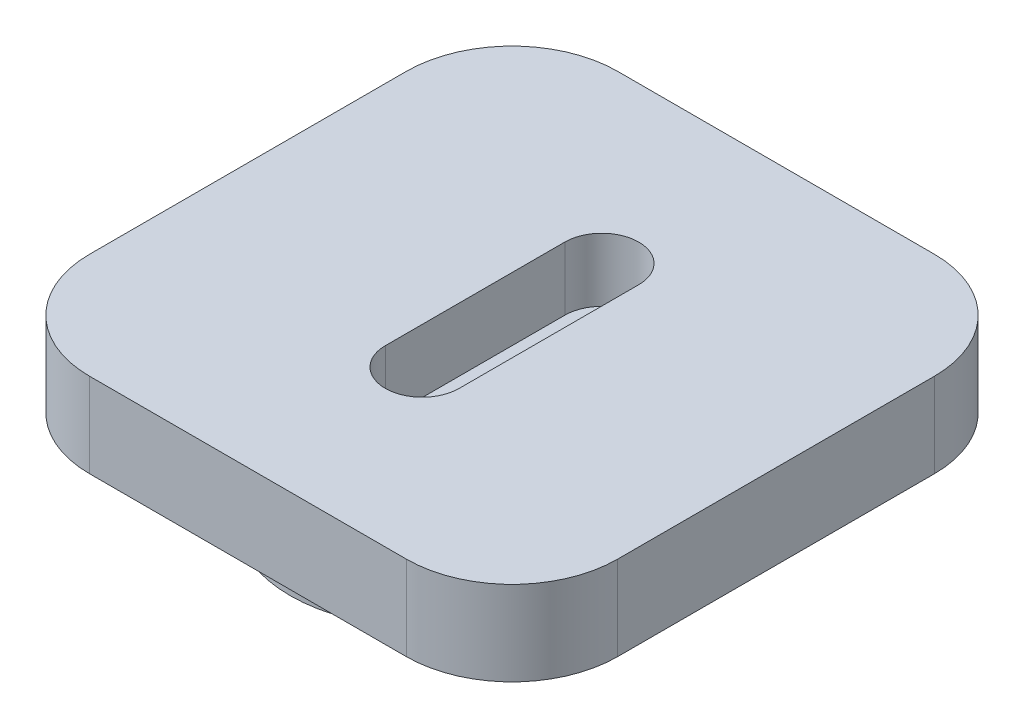
ISO-10303-21;
HEADER;
FILE_DESCRIPTION(('STEP AP214'),'2;1');
FILE_NAME('part.step','',(''),(''),'','','');
FILE_SCHEMA(('AUTOMOTIVE_DESIGN { 1 0 10303 214 1 1 1 1 }'));
ENDSEC;
DATA;
#1=APPLICATION_CONTEXT('core data for automotive mechanical design processes');
#2=APPLICATION_PROTOCOL_DEFINITION('international standard','automotive_design',2000,#1);
#3=PRODUCT_CONTEXT('',#1,'mechanical');
#4=PRODUCT('Part','Part','',(#3));
#5=PRODUCT_RELATED_PRODUCT_CATEGORY('part','',(#4));
#6=PRODUCT_DEFINITION_FORMATION('','',#4);
#7=PRODUCT_DEFINITION_CONTEXT('part definition',#1,'design');
#8=PRODUCT_DEFINITION('design','',#6,#7);
#9=PRODUCT_DEFINITION_SHAPE('','',#8);
#10=(LENGTH_UNIT() NAMED_UNIT(*) SI_UNIT(.MILLI.,.METRE.));
#11=(NAMED_UNIT(*) PLANE_ANGLE_UNIT() SI_UNIT($,.RADIAN.));
#12=(NAMED_UNIT(*) SI_UNIT($,.STERADIAN.) SOLID_ANGLE_UNIT());
#13=UNCERTAINTY_MEASURE_WITH_UNIT(LENGTH_MEASURE(1.E-05),#10,'distance_accuracy_value','');
#14=(GEOMETRIC_REPRESENTATION_CONTEXT(3) GLOBAL_UNCERTAINTY_ASSIGNED_CONTEXT((#13)) GLOBAL_UNIT_ASSIGNED_CONTEXT((#10,
#11,#12)) REPRESENTATION_CONTEXT('',''));
#15=CARTESIAN_POINT('',(0.,0.,0.));
#16=DIRECTION('',(0.,0.,1.));
#17=DIRECTION('',(1.,0.,0.));
#18=AXIS2_PLACEMENT_3D('',#15,#16,#17);
#19=CARTESIAN_POINT('',(0.,0.,0.));
#20=DIRECTION('',(0.,1.,0.));
#21=DIRECTION('',(0.,0.,1.));
#22=AXIS2_PLACEMENT_3D('',#19,#20,#21);
#23=PLANE('',#22);
#24=CARTESIAN_POINT('',(0.,0.,8.5));
#25=DIRECTION('',(0.,-1.,0.));
#26=DIRECTION('',(0.,0.,-1.));
#27=AXIS2_PLACEMENT_3D('',#24,#25,#26);
#28=CIRCLE('',#27,8.75);
#29=CARTESIAN_POINT('',(0.,0.,-0.250000000000002));
#30=VERTEX_POINT('',#29);
#31=EDGE_CURVE('E169',#30,#30,#28,.T.);
#32=ORIENTED_EDGE('',*,*,#31,.F.);
#33=EDGE_LOOP('',(#32));
#34=FACE_BOUND('',#33,.T.);
#35=CARTESIAN_POINT('',(0.,0.,8.5));
#36=DIRECTION('',(0.,-1.,0.));
#37=DIRECTION('',(0.,0.,-1.));
#38=AXIS2_PLACEMENT_3D('',#35,#36,#37);
#39=CIRCLE('',#38,10.25);
#40=CARTESIAN_POINT('',(0.,0.,-1.75000000000001));
#41=VERTEX_POINT('',#40);
#42=EDGE_CURVE('E286',#41,#41,#39,.T.);
#43=ORIENTED_EDGE('',*,*,#42,.T.);
#44=EDGE_LOOP('',(#43));
#45=FACE_BOUND('',#44,.T.);
#46=ADVANCED_FACE('F49',(#34,#45),#23,.F.);
#47=CARTESIAN_POINT('',(0.,0.,8.5));
#48=DIRECTION('',(0.,-1.,0.));
#49=DIRECTION('',(0.,0.,-1.));
#50=AXIS2_PLACEMENT_3D('',#47,#48,#49);
#51=CIRCLE('',#50,11.25);
#52=CARTESIAN_POINT('',(0.,0.,-2.75000000000001));
#53=VERTEX_POINT('',#52);
#54=EDGE_CURVE('E280',#53,#53,#51,.T.);
#55=ORIENTED_EDGE('',*,*,#54,.F.);
#56=EDGE_LOOP('',(#55));
#57=FACE_BOUND('',#56,.T.);
#58=CARTESIAN_POINT('',(0.,0.,8.5));
#59=DIRECTION('',(0.,-1.,0.));
#60=DIRECTION('',(0.,0.,-1.));
#61=AXIS2_PLACEMENT_3D('',#58,#59,#60);
#62=CIRCLE('',#61,12.5);
#63=CARTESIAN_POINT('',(0.,0.,-4.));
#64=VERTEX_POINT('',#63);
#65=EDGE_CURVE('E274',#64,#64,#62,.T.);
#66=ORIENTED_EDGE('',*,*,#65,.T.);
#67=EDGE_LOOP('',(#66));
#68=FACE_BOUND('',#67,.T.);
#69=ADVANCED_FACE('F308',(#57,#68),#23,.F.);
#70=CARTESIAN_POINT('',(0.,0.5,8.5));
#71=DIRECTION('',(0.,1.,0.));
#72=DIRECTION('',(0.,0.,1.));
#73=AXIS2_PLACEMENT_3D('',#70,#71,#72);
#74=CYLINDRICAL_SURFACE('',#73,3.375);
#75=CARTESIAN_POINT('',(0.,6.5,8.5));
#76=DIRECTION('',(0.,1.,0.));
#77=DIRECTION('',(0.,0.,1.));
#78=AXIS2_PLACEMENT_3D('',#75,#76,#77);
#79=CIRCLE('',#78,3.375);
#80=CARTESIAN_POINT('',(0.,6.5,11.875));
#81=VERTEX_POINT('',#80);
#82=EDGE_CURVE('E162',#81,#81,#79,.T.);
#83=ORIENTED_EDGE('',*,*,#82,.T.);
#84=EDGE_LOOP('',(#83));
#85=FACE_BOUND('',#84,.T.);
#86=CARTESIAN_POINT('',(0.,3.,8.5));
#87=DIRECTION('',(0.,-1.,0.));
#88=DIRECTION('',(0.,0.,-1.));
#89=AXIS2_PLACEMENT_3D('',#86,#87,#88);
#90=CIRCLE('',#89,3.375);
#91=CARTESIAN_POINT('',(0.,3.,5.125));
#92=VERTEX_POINT('',#91);
#93=EDGE_CURVE('E160',#92,#92,#90,.F.);
#94=ORIENTED_EDGE('',*,*,#93,.F.);
#95=EDGE_LOOP('',(#94));
#96=FACE_BOUND('',#95,.T.);
#97=ADVANCED_FACE('F311',(#85,#96),#74,.F.);
#98=CARTESIAN_POINT('',(-25.,12.5,-25.));
#99=DIRECTION('',(1.,0.,0.));
#100=DIRECTION('',(0.,0.,-1.));
#101=AXIS2_PLACEMENT_3D('',#98,#99,#100);
#102=PLANE('',#101);
#103=DIRECTION('',(0.,-1.,0.));
#104=VECTOR('',#103,1.);
#105=CARTESIAN_POINT('',(-25.,12.5,-15.));
#106=LINE('',#105,#104);
#107=CARTESIAN_POINT('',(-25.,12.5,-15.));
#108=VERTEX_POINT('',#107);
#109=CARTESIAN_POINT('',(-25.,4.5,-15.));
#110=VERTEX_POINT('',#109);
#111=EDGE_CURVE('E222',#108,#110,#106,.T.);
#112=ORIENTED_EDGE('',*,*,#111,.T.);
#113=DIRECTION('',(0.,0.,1.));
#114=VECTOR('',#113,1.);
#115=CARTESIAN_POINT('',(-25.,4.5,-25.));
#116=LINE('',#115,#114);
#117=CARTESIAN_POINT('',(-25.,4.5,15.));
#118=VERTEX_POINT('',#117);
#119=EDGE_CURVE('E263',#110,#118,#116,.T.);
#120=ORIENTED_EDGE('',*,*,#119,.T.);
#121=DIRECTION('',(0.,-1.,0.));
#122=VECTOR('',#121,1.);
#123=CARTESIAN_POINT('',(-25.,12.5,15.));
#124=LINE('',#123,#122);
#125=CARTESIAN_POINT('',(-25.,12.5,15.));
#126=VERTEX_POINT('',#125);
#127=EDGE_CURVE('E220',#118,#126,#124,.F.);
#128=ORIENTED_EDGE('',*,*,#127,.T.);
#129=DIRECTION('',(0.,0.,1.));
#130=VECTOR('',#129,1.);
#131=CARTESIAN_POINT('',(-25.,12.5,-25.));
#132=LINE('',#131,#130);
#133=EDGE_CURVE('E204',#108,#126,#132,.T.);
#134=ORIENTED_EDGE('',*,*,#133,.F.);
#135=EDGE_LOOP('',(#112,#120,#128,#134));
#136=FACE_BOUND('',#135,.T.);
#137=ADVANCED_FACE('F262',(#136),#102,.F.);
#138=CARTESIAN_POINT('',(-25.,12.5,25.));
#139=DIRECTION('',(0.,0.,-1.));
#140=DIRECTION('',(-1.,0.,0.));
#141=AXIS2_PLACEMENT_3D('',#138,#139,#140);
#142=PLANE('',#141);
#143=DIRECTION('',(0.,-1.,0.));
#144=VECTOR('',#143,1.);
#145=CARTESIAN_POINT('',(-15.,12.5,25.));
#146=LINE('',#145,#144);
#147=CARTESIAN_POINT('',(-15.,12.5,25.));
#148=VERTEX_POINT('',#147);
#149=CARTESIAN_POINT('',(-15.,4.5,25.));
#150=VERTEX_POINT('',#149);
#151=EDGE_CURVE('E57',#148,#150,#146,.T.);
#152=ORIENTED_EDGE('',*,*,#151,.T.);
#153=DIRECTION('',(1.,0.,0.));
#154=VECTOR('',#153,1.);
#155=CARTESIAN_POINT('',(-25.,4.5,25.));
#156=LINE('',#155,#154);
#157=CARTESIAN_POINT('',(15.,4.5,25.));
#158=VERTEX_POINT('',#157);
#159=EDGE_CURVE('E137',#150,#158,#156,.T.);
#160=ORIENTED_EDGE('',*,*,#159,.T.);
#161=DIRECTION('',(0.,-1.,0.));
#162=VECTOR('',#161,1.);
#163=CARTESIAN_POINT('',(15.,12.5,25.));
#164=LINE('',#163,#162);
#165=CARTESIAN_POINT('',(15.,12.5,25.));
#166=VERTEX_POINT('',#165);
#167=EDGE_CURVE('E147',#158,#166,#164,.F.);
#168=ORIENTED_EDGE('',*,*,#167,.T.);
#169=DIRECTION('',(1.,0.,0.));
#170=VECTOR('',#169,1.);
#171=CARTESIAN_POINT('',(-25.,12.5,25.));
#172=LINE('',#171,#170);
#173=EDGE_CURVE('E212',#148,#166,#172,.T.);
#174=ORIENTED_EDGE('',*,*,#173,.F.);
#175=EDGE_LOOP('',(#152,#160,#168,#174));
#176=FACE_BOUND('',#175,.T.);
#177=ADVANCED_FACE('F145',(#176),#142,.F.);
#178=CARTESIAN_POINT('',(25.,12.5,-25.));
#179=DIRECTION('',(-1.,0.,0.));
#180=DIRECTION('',(0.,0.,1.));
#181=AXIS2_PLACEMENT_3D('',#178,#179,#180);
#182=PLANE('',#181);
#183=DIRECTION('',(0.,-1.,0.));
#184=VECTOR('',#183,1.);
#185=CARTESIAN_POINT('',(25.,12.5,15.));
#186=LINE('',#185,#184);
#187=CARTESIAN_POINT('',(25.,12.5,15.));
#188=VERTEX_POINT('',#187);
#189=CARTESIAN_POINT('',(25.,4.5,15.));
#190=VERTEX_POINT('',#189);
#191=EDGE_CURVE('E157',#188,#190,#186,.T.);
#192=ORIENTED_EDGE('',*,*,#191,.T.);
#193=DIRECTION('',(0.,0.,-1.));
#194=VECTOR('',#193,1.);
#195=CARTESIAN_POINT('',(25.,4.5,-25.));
#196=LINE('',#195,#194);
#197=CARTESIAN_POINT('',(25.,4.5,-15.));
#198=VERTEX_POINT('',#197);
#199=EDGE_CURVE('E63',#190,#198,#196,.T.);
#200=ORIENTED_EDGE('',*,*,#199,.T.);
#201=DIRECTION('',(0.,-1.,0.));
#202=VECTOR('',#201,1.);
#203=CARTESIAN_POINT('',(25.,12.5,-15.));
#204=LINE('',#203,#202);
#205=CARTESIAN_POINT('',(25.,12.5,-15.));
#206=VERTEX_POINT('',#205);
#207=EDGE_CURVE('E154',#198,#206,#204,.F.);
#208=ORIENTED_EDGE('',*,*,#207,.T.);
#209=DIRECTION('',(0.,0.,-1.));
#210=VECTOR('',#209,1.);
#211=CARTESIAN_POINT('',(25.,12.5,-25.));
#212=LINE('',#211,#210);
#213=EDGE_CURVE('E214',#188,#206,#212,.T.);
#214=ORIENTED_EDGE('',*,*,#213,.F.);
#215=EDGE_LOOP('',(#192,#200,#208,#214));
#216=FACE_BOUND('',#215,.T.);
#217=ADVANCED_FACE('F238',(#216),#182,.F.);
#218=CARTESIAN_POINT('',(-25.,12.5,-25.));
#219=DIRECTION('',(0.,0.,1.));
#220=DIRECTION('',(1.,0.,0.));
#221=AXIS2_PLACEMENT_3D('',#218,#219,#220);
#222=PLANE('',#221);
#223=DIRECTION('',(0.,-1.,0.));
#224=VECTOR('',#223,1.);
#225=CARTESIAN_POINT('',(15.,12.5,-25.));
#226=LINE('',#225,#224);
#227=CARTESIAN_POINT('',(15.,12.5,-25.));
#228=VERTEX_POINT('',#227);
#229=CARTESIAN_POINT('',(15.,4.5,-25.));
#230=VERTEX_POINT('',#229);
#231=EDGE_CURVE('E225',#228,#230,#226,.T.);
#232=ORIENTED_EDGE('',*,*,#231,.T.);
#233=DIRECTION('',(-1.,0.,0.));
#234=VECTOR('',#233,1.);
#235=CARTESIAN_POINT('',(-25.,4.5,-25.));
#236=LINE('',#235,#234);
#237=CARTESIAN_POINT('',(-15.,4.5,-25.));
#238=VERTEX_POINT('',#237);
#239=EDGE_CURVE('E252',#230,#238,#236,.T.);
#240=ORIENTED_EDGE('',*,*,#239,.T.);
#241=DIRECTION('',(0.,-1.,0.));
#242=VECTOR('',#241,1.);
#243=CARTESIAN_POINT('',(-15.,12.5,-25.));
#244=LINE('',#243,#242);
#245=CARTESIAN_POINT('',(-15.,12.5,-25.));
#246=VERTEX_POINT('',#245);
#247=EDGE_CURVE('E228',#238,#246,#244,.F.);
#248=ORIENTED_EDGE('',*,*,#247,.T.);
#249=DIRECTION('',(-1.,0.,0.));
#250=VECTOR('',#249,1.);
#251=CARTESIAN_POINT('',(-25.,12.5,-25.));
#252=LINE('',#251,#250);
#253=EDGE_CURVE('E217',#228,#246,#252,.T.);
#254=ORIENTED_EDGE('',*,*,#253,.F.);
#255=EDGE_LOOP('',(#232,#240,#248,#254));
#256=FACE_BOUND('',#255,.T.);
#257=ADVANCED_FACE('F251',(#256),#222,.F.);
#258=CARTESIAN_POINT('',(0.,12.5,0.));
#259=DIRECTION('',(0.,1.,0.));
#260=DIRECTION('',(0.,0.,1.));
#261=AXIS2_PLACEMENT_3D('',#258,#259,#260);
#262=PLANE('',#261);
#263=CARTESIAN_POINT('',(0.,12.5,-8.5));
#264=DIRECTION('',(0.,1.,0.));
#265=DIRECTION('',(0.,0.,1.));
#266=AXIS2_PLACEMENT_3D('',#263,#264,#265);
#267=CIRCLE('',#266,3.5);
#268=CARTESIAN_POINT('',(3.5,12.5,-8.5));
#269=VERTEX_POINT('',#268);
#270=CARTESIAN_POINT('',(-3.5,12.5,-8.5));
#271=VERTEX_POINT('',#270);
#272=EDGE_CURVE('E71',#269,#271,#267,.T.);
#273=ORIENTED_EDGE('',*,*,#272,.F.);
#274=DIRECTION('',(0.,0.,-1.));
#275=VECTOR('',#274,1.);
#276=CARTESIAN_POINT('',(3.5,12.5,-8.5));
#277=LINE('',#276,#275);
#278=CARTESIAN_POINT('',(3.5,12.5,8.5));
#279=VERTEX_POINT('',#278);
#280=EDGE_CURVE('E183',#279,#269,#277,.T.);
#281=ORIENTED_EDGE('',*,*,#280,.F.);
#282=CARTESIAN_POINT('',(0.,12.5,8.5));
#283=DIRECTION('',(0.,1.,0.));
#284=DIRECTION('',(0.,0.,1.));
#285=AXIS2_PLACEMENT_3D('',#282,#283,#284);
#286=CIRCLE('',#285,3.5);
#287=CARTESIAN_POINT('',(-3.5,12.5,8.5));
#288=VERTEX_POINT('',#287);
#289=EDGE_CURVE('E197',#288,#279,#286,.T.);
#290=ORIENTED_EDGE('',*,*,#289,.F.);
#291=DIRECTION('',(0.,0.,1.));
#292=VECTOR('',#291,1.);
#293=CARTESIAN_POINT('',(-3.5,12.5,-8.5));
#294=LINE('',#293,#292);
#295=EDGE_CURVE('E194',#271,#288,#294,.T.);
#296=ORIENTED_EDGE('',*,*,#295,.F.);
#297=EDGE_LOOP('',(#273,#281,#290,#296));
#298=FACE_BOUND('',#297,.T.);
#299=ORIENTED_EDGE('',*,*,#253,.T.);
#300=CARTESIAN_POINT('',(-15.,12.5,-15.));
#301=DIRECTION('',(0.,1.,0.));
#302=DIRECTION('',(0.,0.,1.));
#303=AXIS2_PLACEMENT_3D('',#300,#301,#302);
#304=CIRCLE('',#303,10.);
#305=EDGE_CURVE('E235',#246,#108,#304,.T.);
#306=ORIENTED_EDGE('',*,*,#305,.T.);
#307=ORIENTED_EDGE('',*,*,#133,.T.);
#308=CARTESIAN_POINT('',(-15.,12.5,15.));
#309=DIRECTION('',(0.,1.,0.));
#310=DIRECTION('',(0.,0.,1.));
#311=AXIS2_PLACEMENT_3D('',#308,#309,#310);
#312=CIRCLE('',#311,10.);
#313=EDGE_CURVE('E231',#126,#148,#312,.T.);
#314=ORIENTED_EDGE('',*,*,#313,.T.);
#315=ORIENTED_EDGE('',*,*,#173,.T.);
#316=CARTESIAN_POINT('',(15.,12.5,15.));
#317=DIRECTION('',(0.,1.,0.));
#318=DIRECTION('',(0.,0.,1.));
#319=AXIS2_PLACEMENT_3D('',#316,#317,#318);
#320=CIRCLE('',#319,10.);
#321=EDGE_CURVE('E153',#166,#188,#320,.T.);
#322=ORIENTED_EDGE('',*,*,#321,.T.);
#323=ORIENTED_EDGE('',*,*,#213,.T.);
#324=CARTESIAN_POINT('',(15.,12.5,-15.));
#325=DIRECTION('',(0.,1.,0.));
#326=DIRECTION('',(0.,0.,1.));
#327=AXIS2_PLACEMENT_3D('',#324,#325,#326);
#328=CIRCLE('',#327,10.);
#329=EDGE_CURVE('E233',#206,#228,#328,.T.);
#330=ORIENTED_EDGE('',*,*,#329,.T.);
#331=EDGE_LOOP('',(#299,#306,#307,#314,#315,#322,#323,#330));
#332=FACE_BOUND('',#331,.T.);
#333=ADVANCED_FACE('F242',(#298,#332),#262,.T.);
#334=CARTESIAN_POINT('',(-15.,12.5,-15.));
#335=DIRECTION('',(0.,-1.,0.));
#336=DIRECTION('',(0.,0.,-1.));
#337=AXIS2_PLACEMENT_3D('',#334,#335,#336);
#338=CYLINDRICAL_SURFACE('',#337,10.);
#339=CARTESIAN_POINT('',(-15.,4.5,-15.));
#340=DIRECTION('',(0.,1.,0.));
#341=DIRECTION('',(0.,0.,1.));
#342=AXIS2_PLACEMENT_3D('',#339,#340,#341);
#343=CIRCLE('',#342,10.);
#344=EDGE_CURVE('E174',#110,#238,#343,.F.);
#345=ORIENTED_EDGE('',*,*,#344,.F.);
#346=ORIENTED_EDGE('',*,*,#111,.F.);
#347=ORIENTED_EDGE('',*,*,#305,.F.);
#348=ORIENTED_EDGE('',*,*,#247,.F.);
#349=EDGE_LOOP('',(#345,#346,#347,#348));
#350=FACE_BOUND('',#349,.T.);
#351=ADVANCED_FACE('F259',(#350),#338,.T.);
#352=CARTESIAN_POINT('',(15.,12.5,-15.));
#353=DIRECTION('',(0.,-1.,0.));
#354=DIRECTION('',(0.,0.,-1.));
#355=AXIS2_PLACEMENT_3D('',#352,#353,#354);
#356=CYLINDRICAL_SURFACE('',#355,10.);
#357=CARTESIAN_POINT('',(15.,4.5,-15.));
#358=DIRECTION('',(0.,1.,0.));
#359=DIRECTION('',(0.,0.,1.));
#360=AXIS2_PLACEMENT_3D('',#357,#358,#359);
#361=CIRCLE('',#360,10.);
#362=EDGE_CURVE('E248',#230,#198,#361,.F.);
#363=ORIENTED_EDGE('',*,*,#362,.F.);
#364=ORIENTED_EDGE('',*,*,#231,.F.);
#365=ORIENTED_EDGE('',*,*,#329,.F.);
#366=ORIENTED_EDGE('',*,*,#207,.F.);
#367=EDGE_LOOP('',(#363,#364,#365,#366));
#368=FACE_BOUND('',#367,.T.);
#369=ADVANCED_FACE('F247',(#368),#356,.T.);
#370=CARTESIAN_POINT('',(-15.,12.5,15.));
#371=DIRECTION('',(0.,-1.,0.));
#372=DIRECTION('',(0.,0.,-1.));
#373=AXIS2_PLACEMENT_3D('',#370,#371,#372);
#374=CYLINDRICAL_SURFACE('',#373,10.);
#375=CARTESIAN_POINT('',(-15.,4.5,15.));
#376=DIRECTION('',(0.,1.,0.));
#377=DIRECTION('',(0.,0.,1.));
#378=AXIS2_PLACEMENT_3D('',#375,#376,#377);
#379=CIRCLE('',#378,10.);
#380=EDGE_CURVE('E150',#150,#118,#379,.F.);
#381=ORIENTED_EDGE('',*,*,#380,.F.);
#382=ORIENTED_EDGE('',*,*,#151,.F.);
#383=ORIENTED_EDGE('',*,*,#313,.F.);
#384=ORIENTED_EDGE('',*,*,#127,.F.);
#385=EDGE_LOOP('',(#381,#382,#383,#384));
#386=FACE_BOUND('',#385,.T.);
#387=ADVANCED_FACE('F267',(#386),#374,.T.);
#388=CARTESIAN_POINT('',(15.,12.5,15.));
#389=DIRECTION('',(0.,-1.,0.));
#390=DIRECTION('',(0.,0.,-1.));
#391=AXIS2_PLACEMENT_3D('',#388,#389,#390);
#392=CYLINDRICAL_SURFACE('',#391,10.);
#393=CARTESIAN_POINT('',(15.,4.5,15.));
#394=DIRECTION('',(0.,1.,0.));
#395=DIRECTION('',(0.,0.,1.));
#396=AXIS2_PLACEMENT_3D('',#393,#394,#395);
#397=CIRCLE('',#396,10.);
#398=EDGE_CURVE('E12',#190,#158,#397,.F.);
#399=ORIENTED_EDGE('',*,*,#398,.F.);
#400=ORIENTED_EDGE('',*,*,#191,.F.);
#401=ORIENTED_EDGE('',*,*,#321,.F.);
#402=ORIENTED_EDGE('',*,*,#167,.F.);
#403=EDGE_LOOP('',(#399,#400,#401,#402));
#404=FACE_BOUND('',#403,.T.);
#405=ADVANCED_FACE('F51',(#404),#392,.T.);
#406=CARTESIAN_POINT('',(0.,6.5,-8.5));
#407=DIRECTION('',(0.,1.,0.));
#408=DIRECTION('',(0.,0.,1.));
#409=AXIS2_PLACEMENT_3D('',#406,#407,#408);
#410=CYLINDRICAL_SURFACE('',#409,3.5);
#411=ORIENTED_EDGE('',*,*,#272,.T.);
#412=DIRECTION('',(0.,1.,0.));
#413=VECTOR('',#412,1.);
#414=CARTESIAN_POINT('',(-3.5,6.5,-8.5));
#415=LINE('',#414,#413);
#416=CARTESIAN_POINT('',(-3.5,6.5,-8.5));
#417=VERTEX_POINT('',#416);
#418=EDGE_CURVE('E192',#417,#271,#415,.T.);
#419=ORIENTED_EDGE('',*,*,#418,.F.);
#420=CARTESIAN_POINT('',(0.,6.5,-8.5));
#421=DIRECTION('',(0.,1.,0.));
#422=DIRECTION('',(0.,0.,1.));
#423=AXIS2_PLACEMENT_3D('',#420,#421,#422);
#424=CIRCLE('',#423,3.5);
#425=CARTESIAN_POINT('',(3.5,6.5,-8.5));
#426=VERTEX_POINT('',#425);
#427=EDGE_CURVE('E179',#426,#417,#424,.T.);
#428=ORIENTED_EDGE('',*,*,#427,.F.);
#429=DIRECTION('',(0.,1.,0.));
#430=VECTOR('',#429,1.);
#431=CARTESIAN_POINT('',(3.5,6.5,-8.5));
#432=LINE('',#431,#430);
#433=EDGE_CURVE('E202',#426,#269,#432,.T.);
#434=ORIENTED_EDGE('',*,*,#433,.T.);
#435=EDGE_LOOP('',(#411,#419,#428,#434));
#436=FACE_BOUND('',#435,.T.);
#437=ADVANCED_FACE('F347',(#436),#410,.F.);
#438=CARTESIAN_POINT('',(3.5,6.5,-8.5));
#439=DIRECTION('',(1.,0.,0.));
#440=DIRECTION('',(0.,0.,-1.));
#441=AXIS2_PLACEMENT_3D('',#438,#439,#440);
#442=PLANE('',#441);
#443=ORIENTED_EDGE('',*,*,#280,.T.);
#444=ORIENTED_EDGE('',*,*,#433,.F.);
#445=DIRECTION('',(0.,0.,-1.));
#446=VECTOR('',#445,1.);
#447=CARTESIAN_POINT('',(3.5,6.5,-8.5));
#448=LINE('',#447,#446);
#449=CARTESIAN_POINT('',(3.5,6.5,8.5));
#450=VERTEX_POINT('',#449);
#451=EDGE_CURVE('E189',#450,#426,#448,.T.);
#452=ORIENTED_EDGE('',*,*,#451,.F.);
#453=DIRECTION('',(0.,1.,0.));
#454=VECTOR('',#453,1.);
#455=CARTESIAN_POINT('',(3.5,6.5,8.5));
#456=LINE('',#455,#454);
#457=EDGE_CURVE('E205',#450,#279,#456,.T.);
#458=ORIENTED_EDGE('',*,*,#457,.T.);
#459=EDGE_LOOP('',(#443,#444,#452,#458));
#460=FACE_BOUND('',#459,.T.);
#461=ADVANCED_FACE('F351',(#460),#442,.F.);
#462=CARTESIAN_POINT('',(0.,6.5,8.5));
#463=DIRECTION('',(0.,1.,0.));
#464=DIRECTION('',(0.,0.,1.));
#465=AXIS2_PLACEMENT_3D('',#462,#463,#464);
#466=CYLINDRICAL_SURFACE('',#465,3.5);
#467=ORIENTED_EDGE('',*,*,#289,.T.);
#468=ORIENTED_EDGE('',*,*,#457,.F.);
#469=CARTESIAN_POINT('',(0.,6.5,8.5));
#470=DIRECTION('',(0.,1.,0.));
#471=DIRECTION('',(0.,0.,1.));
#472=AXIS2_PLACEMENT_3D('',#469,#470,#471);
#473=CIRCLE('',#472,3.5);
#474=CARTESIAN_POINT('',(-3.5,6.5,8.5));
#475=VERTEX_POINT('',#474);
#476=EDGE_CURVE('E186',#475,#450,#473,.T.);
#477=ORIENTED_EDGE('',*,*,#476,.F.);
#478=DIRECTION('',(0.,1.,0.));
#479=VECTOR('',#478,1.);
#480=CARTESIAN_POINT('',(-3.5,6.5,8.5));
#481=LINE('',#480,#479);
#482=EDGE_CURVE('E207',#475,#288,#481,.T.);
#483=ORIENTED_EDGE('',*,*,#482,.T.);
#484=EDGE_LOOP('',(#467,#468,#477,#483));
#485=FACE_BOUND('',#484,.T.);
#486=ADVANCED_FACE('F355',(#485),#466,.F.);
#487=CARTESIAN_POINT('',(-3.5,6.5,-8.5));
#488=DIRECTION('',(-1.,0.,0.));
#489=DIRECTION('',(0.,0.,1.));
#490=AXIS2_PLACEMENT_3D('',#487,#488,#489);
#491=PLANE('',#490);
#492=ORIENTED_EDGE('',*,*,#295,.T.);
#493=ORIENTED_EDGE('',*,*,#482,.F.);
#494=DIRECTION('',(0.,0.,1.));
#495=VECTOR('',#494,1.);
#496=CARTESIAN_POINT('',(-3.5,6.5,-8.5));
#497=LINE('',#496,#495);
#498=EDGE_CURVE('E182',#417,#475,#497,.T.);
#499=ORIENTED_EDGE('',*,*,#498,.F.);
#500=ORIENTED_EDGE('',*,*,#418,.T.);
#501=EDGE_LOOP('',(#492,#493,#499,#500));
#502=FACE_BOUND('',#501,.T.);
#503=ADVANCED_FACE('F359',(#502),#491,.F.);
#504=CARTESIAN_POINT('',(0.,6.5,-8.5));
#505=DIRECTION('',(0.,1.,0.));
#506=DIRECTION('',(0.,0.,1.));
#507=AXIS2_PLACEMENT_3D('',#504,#505,#506);
#508=PLANE('',#507);
#509=ORIENTED_EDGE('',*,*,#82,.F.);
#510=EDGE_LOOP('',(#509));
#511=FACE_BOUND('',#510,.T.);
#512=ORIENTED_EDGE('',*,*,#427,.T.);
#513=ORIENTED_EDGE('',*,*,#498,.T.);
#514=ORIENTED_EDGE('',*,*,#476,.T.);
#515=ORIENTED_EDGE('',*,*,#451,.T.);
#516=EDGE_LOOP('',(#512,#513,#514,#515));
#517=FACE_BOUND('',#516,.T.);
#518=ADVANCED_FACE('F362',(#511,#517),#508,.T.);
#519=CARTESIAN_POINT('',(0.,3.,8.5));
#520=DIRECTION('',(0.,-1.,0.));
#521=DIRECTION('',(0.,0.,-1.));
#522=AXIS2_PLACEMENT_3D('',#519,#520,#521);
#523=PLANE('',#522);
#524=CARTESIAN_POINT('',(0.,3.,8.5));
#525=DIRECTION('',(0.,-1.,0.));
#526=DIRECTION('',(0.,0.,-1.));
#527=AXIS2_PLACEMENT_3D('',#524,#525,#526);
#528=CIRCLE('',#527,8.75);
#529=CARTESIAN_POINT('',(0.,3.,-0.250000000000002));
#530=VERTEX_POINT('',#529);
#531=EDGE_CURVE('E163',#530,#530,#528,.T.);
#532=ORIENTED_EDGE('',*,*,#531,.T.);
#533=EDGE_LOOP('',(#532));
#534=FACE_BOUND('',#533,.T.);
#535=ORIENTED_EDGE('',*,*,#93,.T.);
#536=EDGE_LOOP('',(#535));
#537=FACE_BOUND('',#536,.T.);
#538=ADVANCED_FACE('F369',(#534,#537),#523,.T.);
#539=CARTESIAN_POINT('',(0.,3.,8.5));
#540=DIRECTION('',(0.,-1.,0.));
#541=DIRECTION('',(0.,0.,-1.));
#542=AXIS2_PLACEMENT_3D('',#539,#540,#541);
#543=CYLINDRICAL_SURFACE('',#542,8.75);
#544=ORIENTED_EDGE('',*,*,#531,.F.);
#545=EDGE_LOOP('',(#544));
#546=FACE_BOUND('',#545,.T.);
#547=ORIENTED_EDGE('',*,*,#31,.T.);
#548=EDGE_LOOP('',(#547));
#549=FACE_BOUND('',#548,.T.);
#550=ADVANCED_FACE('F321',(#546,#549),#543,.F.);
#551=CARTESIAN_POINT('',(0.,4.5,0.));
#552=DIRECTION('',(0.,1.,0.));
#553=DIRECTION('',(0.,0.,1.));
#554=AXIS2_PLACEMENT_3D('',#551,#552,#553);
#555=PLANE('',#554);
#556=ORIENTED_EDGE('',*,*,#344,.T.);
#557=ORIENTED_EDGE('',*,*,#239,.F.);
#558=ORIENTED_EDGE('',*,*,#362,.T.);
#559=ORIENTED_EDGE('',*,*,#199,.F.);
#560=ORIENTED_EDGE('',*,*,#398,.T.);
#561=ORIENTED_EDGE('',*,*,#159,.F.);
#562=ORIENTED_EDGE('',*,*,#380,.T.);
#563=ORIENTED_EDGE('',*,*,#119,.F.);
#564=EDGE_LOOP('',(#556,#557,#558,#559,#560,#561,#562,#563));
#565=FACE_BOUND('',#564,.T.);
#566=CARTESIAN_POINT('',(0.,4.5,8.5));
#567=DIRECTION('',(0.,-1.,0.));
#568=DIRECTION('',(0.,0.,-1.));
#569=AXIS2_PLACEMENT_3D('',#566,#567,#568);
#570=CIRCLE('',#569,12.5);
#571=CARTESIAN_POINT('',(0.,4.5,-4.));
#572=VERTEX_POINT('',#571);
#573=EDGE_CURVE('E273',#572,#572,#570,.T.);
#574=ORIENTED_EDGE('',*,*,#573,.F.);
#575=EDGE_LOOP('',(#574));
#576=FACE_BOUND('',#575,.T.);
#577=ADVANCED_FACE('F135',(#565,#576),#555,.F.);
#578=CARTESIAN_POINT('',(0.,4.5,8.5));
#579=DIRECTION('',(0.,-1.,0.));
#580=DIRECTION('',(0.,0.,-1.));
#581=AXIS2_PLACEMENT_3D('',#578,#579,#580);
#582=CYLINDRICAL_SURFACE('',#581,12.5);
#583=ORIENTED_EDGE('',*,*,#573,.T.);
#584=EDGE_LOOP('',(#583));
#585=FACE_BOUND('',#584,.T.);
#586=ORIENTED_EDGE('',*,*,#65,.F.);
#587=EDGE_LOOP('',(#586));
#588=FACE_BOUND('',#587,.T.);
#589=ADVANCED_FACE('F304',(#585,#588),#582,.T.);
#590=CARTESIAN_POINT('',(0.,2.,8.5));
#591=DIRECTION('',(0.,-1.,0.));
#592=DIRECTION('',(0.,0.,-1.));
#593=AXIS2_PLACEMENT_3D('',#590,#591,#592);
#594=CYLINDRICAL_SURFACE('',#593,11.25);
#595=CARTESIAN_POINT('',(0.,2.,8.5));
#596=DIRECTION('',(0.,-1.,0.));
#597=DIRECTION('',(0.,0.,-1.));
#598=AXIS2_PLACEMENT_3D('',#595,#596,#597);
#599=CIRCLE('',#598,11.25);
#600=CARTESIAN_POINT('',(0.,2.,-2.75000000000001));
#601=VERTEX_POINT('',#600);
#602=EDGE_CURVE('E277',#601,#601,#599,.T.);
#603=ORIENTED_EDGE('',*,*,#602,.F.);
#604=EDGE_LOOP('',(#603));
#605=FACE_BOUND('',#604,.T.);
#606=ORIENTED_EDGE('',*,*,#54,.T.);
#607=EDGE_LOOP('',(#606));
#608=FACE_BOUND('',#607,.T.);
#609=ADVANCED_FACE('F298',(#605,#608),#594,.F.);
#610=CARTESIAN_POINT('',(0.,2.,8.5));
#611=DIRECTION('',(0.,-1.,0.));
#612=DIRECTION('',(0.,0.,-1.));
#613=AXIS2_PLACEMENT_3D('',#610,#611,#612);
#614=PLANE('',#613);
#615=CARTESIAN_POINT('',(0.,2.,8.5));
#616=DIRECTION('',(0.,-1.,0.));
#617=DIRECTION('',(0.,0.,-1.));
#618=AXIS2_PLACEMENT_3D('',#615,#616,#617);
#619=CIRCLE('',#618,10.25);
#620=CARTESIAN_POINT('',(0.,2.,-1.75000000000001));
#621=VERTEX_POINT('',#620);
#622=EDGE_CURVE('E283',#621,#621,#619,.T.);
#623=ORIENTED_EDGE('',*,*,#622,.F.);
#624=EDGE_LOOP('',(#623));
#625=FACE_BOUND('',#624,.T.);
#626=ORIENTED_EDGE('',*,*,#602,.T.);
#627=EDGE_LOOP('',(#626));
#628=FACE_BOUND('',#627,.T.);
#629=ADVANCED_FACE('F295',(#625,#628),#614,.T.);
#630=CARTESIAN_POINT('',(0.,2.,8.5));
#631=DIRECTION('',(0.,-1.,0.));
#632=DIRECTION('',(0.,0.,-1.));
#633=AXIS2_PLACEMENT_3D('',#630,#631,#632);
#634=CYLINDRICAL_SURFACE('',#633,10.25);
#635=ORIENTED_EDGE('',*,*,#622,.T.);
#636=EDGE_LOOP('',(#635));
#637=FACE_BOUND('',#636,.T.);
#638=ORIENTED_EDGE('',*,*,#42,.F.);
#639=EDGE_LOOP('',(#638));
#640=FACE_BOUND('',#639,.T.);
#641=ADVANCED_FACE('F292',(#637,#640),#634,.T.);
#642=CLOSED_SHELL('',(#46,#69,#97,#137,#177,#217,#257,#333,#351,#369,#387,#405,#437,#461,#486,
#503,#518,#538,#550,#577,#589,#609,#629,#641));
#643=MANIFOLD_SOLID_BREP('B2',#642);
#644=ADVANCED_BREP_SHAPE_REPRESENTATION('',(#18,#643),#14);
#645=SHAPE_DEFINITION_REPRESENTATION(#9,#644);
ENDSEC;
END-ISO-10303-21;
